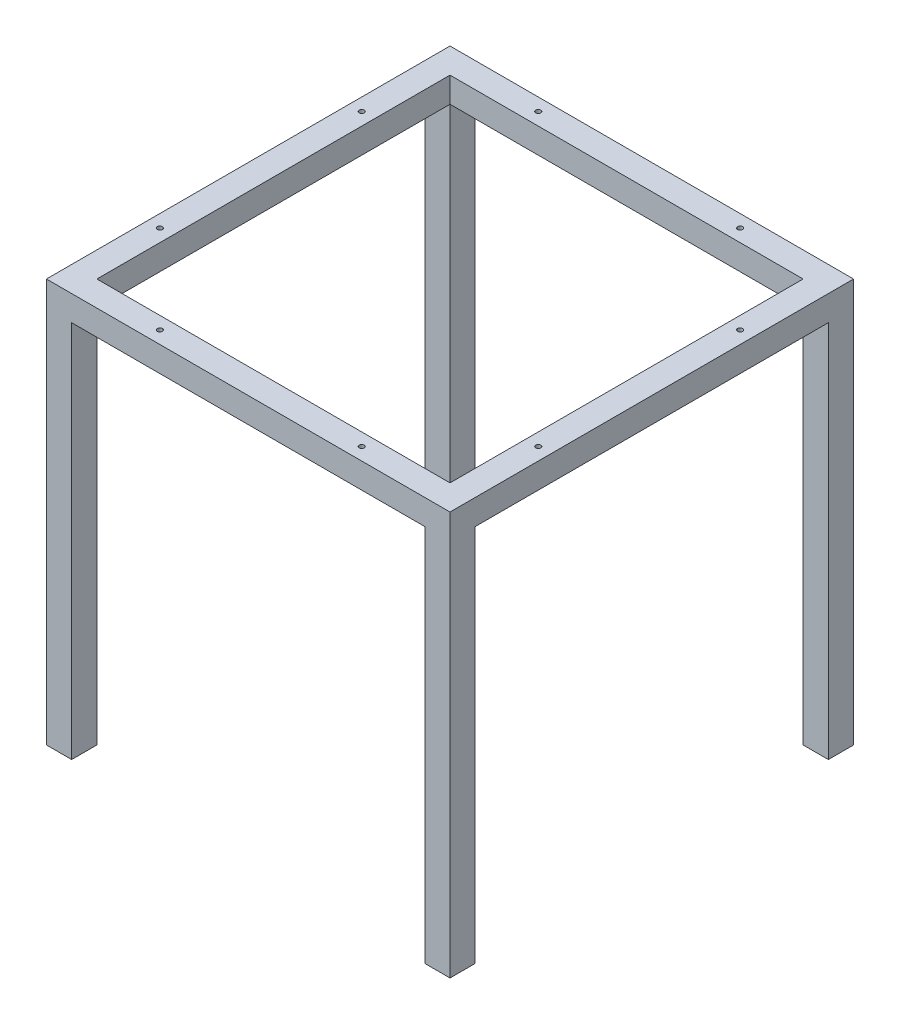
ISO-10303-21;
HEADER;
FILE_DESCRIPTION(('STEP AP214'),'2;1');
FILE_NAME('part.step','',(''),(''),'','','');
FILE_SCHEMA(('AUTOMOTIVE_DESIGN { 1 0 10303 214 1 1 1 1 }'));
ENDSEC;
DATA;
#1=APPLICATION_CONTEXT('core data for automotive mechanical design processes');
#2=APPLICATION_PROTOCOL_DEFINITION('international standard','automotive_design',2000,#1);
#3=PRODUCT_CONTEXT('',#1,'mechanical');
#4=PRODUCT('Part','Part','',(#3));
#5=PRODUCT_RELATED_PRODUCT_CATEGORY('part','',(#4));
#6=PRODUCT_DEFINITION_FORMATION('','',#4);
#7=PRODUCT_DEFINITION_CONTEXT('part definition',#1,'design');
#8=PRODUCT_DEFINITION('design','',#6,#7);
#9=PRODUCT_DEFINITION_SHAPE('','',#8);
#10=(LENGTH_UNIT() NAMED_UNIT(*) SI_UNIT(.MILLI.,.METRE.));
#11=(NAMED_UNIT(*) PLANE_ANGLE_UNIT() SI_UNIT($,.RADIAN.));
#12=(NAMED_UNIT(*) SI_UNIT($,.STERADIAN.) SOLID_ANGLE_UNIT());
#13=UNCERTAINTY_MEASURE_WITH_UNIT(LENGTH_MEASURE(1.E-05),#10,'distance_accuracy_value','');
#14=(GEOMETRIC_REPRESENTATION_CONTEXT(3) GLOBAL_UNCERTAINTY_ASSIGNED_CONTEXT((#13)) GLOBAL_UNIT_ASSIGNED_CONTEXT((#10,
#11,#12)) REPRESENTATION_CONTEXT('',''));
#15=CARTESIAN_POINT('',(0.,0.,0.));
#16=DIRECTION('',(0.,0.,1.));
#17=DIRECTION('',(1.,0.,0.));
#18=AXIS2_PLACEMENT_3D('',#15,#16,#17);
#19=CARTESIAN_POINT('',(0.,0.,0.));
#20=DIRECTION('',(0.,-1.,0.));
#21=DIRECTION('',(0.,0.,-1.));
#22=AXIS2_PLACEMENT_3D('',#19,#20,#21);
#23=PLANE('',#22);
#24=CARTESIAN_POINT('',(200.,0.,-375.));
#25=DIRECTION('',(0.,-1.,0.));
#26=DIRECTION('',(0.,0.,-1.));
#27=AXIS2_PLACEMENT_3D('',#24,#25,#26);
#28=CIRCLE('',#27,4.99999999999999);
#29=CARTESIAN_POINT('',(200.,0.,-380.));
#30=VERTEX_POINT('',#29);
#31=EDGE_CURVE('E395',#30,#30,#28,.T.);
#32=ORIENTED_EDGE('',*,*,#31,.F.);
#33=EDGE_LOOP('',(#32));
#34=FACE_BOUND('',#33,.T.);
#35=CARTESIAN_POINT('',(-200.,0.,-375.));
#36=DIRECTION('',(0.,-1.,0.));
#37=DIRECTION('',(0.,0.,-1.));
#38=AXIS2_PLACEMENT_3D('',#35,#36,#37);
#39=CIRCLE('',#38,4.99999999999999);
#40=CARTESIAN_POINT('',(-200.,0.,-380.));
#41=VERTEX_POINT('',#40);
#42=EDGE_CURVE('E390',#41,#41,#39,.T.);
#43=ORIENTED_EDGE('',*,*,#42,.F.);
#44=EDGE_LOOP('',(#43));
#45=FACE_BOUND('',#44,.T.);
#46=DIRECTION('',(-1.,0.,0.));
#47=VECTOR('',#46,1.);
#48=CARTESIAN_POINT('',(-350.,0.,-350.));
#49=LINE('',#48,#47);
#50=CARTESIAN_POINT('',(350.,0.,-350.));
#51=VERTEX_POINT('',#50);
#52=CARTESIAN_POINT('',(-350.,0.,-350.));
#53=VERTEX_POINT('',#52);
#54=EDGE_CURVE('E313',#51,#53,#49,.T.);
#55=ORIENTED_EDGE('',*,*,#54,.T.);
#56=DIRECTION('',(0.,0.,-1.));
#57=VECTOR('',#56,1.);
#58=CARTESIAN_POINT('',(-350.,0.,0.));
#59=LINE('',#58,#57);
#60=CARTESIAN_POINT('',(-350.,0.,-400.));
#61=VERTEX_POINT('',#60);
#62=EDGE_CURVE('E202',#53,#61,#59,.T.);
#63=ORIENTED_EDGE('',*,*,#62,.T.);
#64=DIRECTION('',(-1.,0.,0.));
#65=VECTOR('',#64,1.);
#66=CARTESIAN_POINT('',(-400.,0.,-400.));
#67=LINE('',#66,#65);
#68=CARTESIAN_POINT('',(350.,0.,-400.));
#69=VERTEX_POINT('',#68);
#70=EDGE_CURVE('E371',#69,#61,#67,.T.);
#71=ORIENTED_EDGE('',*,*,#70,.F.);
#72=DIRECTION('',(0.,0.,1.));
#73=VECTOR('',#72,1.);
#74=CARTESIAN_POINT('',(350.,0.,0.));
#75=LINE('',#74,#73);
#76=EDGE_CURVE('E237',#69,#51,#75,.T.);
#77=ORIENTED_EDGE('',*,*,#76,.T.);
#78=EDGE_LOOP('',(#55,#63,#71,#77));
#79=FACE_BOUND('',#78,.T.);
#80=ADVANCED_FACE('F45',(#34,#45,#79),#23,.T.);
#81=CARTESIAN_POINT('',(-375.,0.,-200.));
#82=DIRECTION('',(0.,-1.,0.));
#83=DIRECTION('',(0.,0.,-1.));
#84=AXIS2_PLACEMENT_3D('',#81,#82,#83);
#85=CIRCLE('',#84,4.99999999999999);
#86=CARTESIAN_POINT('',(-375.,0.,-205.));
#87=VERTEX_POINT('',#86);
#88=EDGE_CURVE('E432',#87,#87,#85,.T.);
#89=ORIENTED_EDGE('',*,*,#88,.F.);
#90=EDGE_LOOP('',(#89));
#91=FACE_BOUND('',#90,.T.);
#92=CARTESIAN_POINT('',(-375.,0.,200.));
#93=DIRECTION('',(0.,-1.,0.));
#94=DIRECTION('',(0.,0.,-1.));
#95=AXIS2_PLACEMENT_3D('',#92,#93,#94);
#96=CIRCLE('',#95,4.99999999999999);
#97=CARTESIAN_POINT('',(-375.,0.,195.));
#98=VERTEX_POINT('',#97);
#99=EDGE_CURVE('E418',#98,#98,#96,.T.);
#100=ORIENTED_EDGE('',*,*,#99,.F.);
#101=EDGE_LOOP('',(#100));
#102=FACE_BOUND('',#101,.T.);
#103=DIRECTION('',(0.,0.,1.));
#104=VECTOR('',#103,1.);
#105=CARTESIAN_POINT('',(-400.,0.,400.));
#106=LINE('',#105,#104);
#107=CARTESIAN_POINT('',(-400.,0.,-350.));
#108=VERTEX_POINT('',#107);
#109=CARTESIAN_POINT('',(-400.,0.,350.));
#110=VERTEX_POINT('',#109);
#111=EDGE_CURVE('E374',#108,#110,#106,.T.);
#112=ORIENTED_EDGE('',*,*,#111,.F.);
#113=DIRECTION('',(1.,0.,0.));
#114=VECTOR('',#113,1.);
#115=CARTESIAN_POINT('',(0.,0.,-350.));
#116=LINE('',#115,#114);
#117=EDGE_CURVE('E191',#108,#53,#116,.T.);
#118=ORIENTED_EDGE('',*,*,#117,.T.);
#119=DIRECTION('',(0.,0.,1.));
#120=VECTOR('',#119,1.);
#121=CARTESIAN_POINT('',(-350.,0.,-350.));
#122=LINE('',#121,#120);
#123=CARTESIAN_POINT('',(-350.,0.,350.));
#124=VERTEX_POINT('',#123);
#125=EDGE_CURVE('E308',#53,#124,#122,.T.);
#126=ORIENTED_EDGE('',*,*,#125,.T.);
#127=DIRECTION('',(-1.,0.,0.));
#128=VECTOR('',#127,1.);
#129=CARTESIAN_POINT('',(3.88578058618804E-13,0.,350.));
#130=LINE('',#129,#128);
#131=EDGE_CURVE('E304',#124,#110,#130,.T.);
#132=ORIENTED_EDGE('',*,*,#131,.T.);
#133=EDGE_LOOP('',(#112,#118,#126,#132));
#134=FACE_BOUND('',#133,.T.);
#135=ADVANCED_FACE('F460',(#91,#102,#134),#23,.T.);
#136=CARTESIAN_POINT('',(375.,0.,200.));
#137=DIRECTION('',(0.,-1.,0.));
#138=DIRECTION('',(0.,0.,-1.));
#139=AXIS2_PLACEMENT_3D('',#136,#137,#138);
#140=CIRCLE('',#139,4.99999999999999);
#141=CARTESIAN_POINT('',(375.,0.,195.));
#142=VERTEX_POINT('',#141);
#143=EDGE_CURVE('E405',#142,#142,#140,.T.);
#144=ORIENTED_EDGE('',*,*,#143,.F.);
#145=EDGE_LOOP('',(#144));
#146=FACE_BOUND('',#145,.T.);
#147=CARTESIAN_POINT('',(375.,0.,-200.));
#148=DIRECTION('',(0.,-1.,0.));
#149=DIRECTION('',(0.,0.,-1.));
#150=AXIS2_PLACEMENT_3D('',#147,#148,#149);
#151=CIRCLE('',#150,4.99999999999999);
#152=CARTESIAN_POINT('',(375.,0.,-205.));
#153=VERTEX_POINT('',#152);
#154=EDGE_CURVE('E400',#153,#153,#151,.T.);
#155=ORIENTED_EDGE('',*,*,#154,.F.);
#156=EDGE_LOOP('',(#155));
#157=FACE_BOUND('',#156,.T.);
#158=DIRECTION('',(0.,0.,-1.));
#159=VECTOR('',#158,1.);
#160=CARTESIAN_POINT('',(350.,0.,-350.));
#161=LINE('',#160,#159);
#162=CARTESIAN_POINT('',(350.,0.,350.));
#163=VERTEX_POINT('',#162);
#164=EDGE_CURVE('E331',#163,#51,#161,.T.);
#165=ORIENTED_EDGE('',*,*,#164,.T.);
#166=DIRECTION('',(1.,0.,0.));
#167=VECTOR('',#166,1.);
#168=CARTESIAN_POINT('',(0.,0.,-350.));
#169=LINE('',#168,#167);
#170=CARTESIAN_POINT('',(400.,0.,-350.));
#171=VERTEX_POINT('',#170);
#172=EDGE_CURVE('E241',#51,#171,#169,.T.);
#173=ORIENTED_EDGE('',*,*,#172,.T.);
#174=DIRECTION('',(0.,0.,-1.));
#175=VECTOR('',#174,1.);
#176=CARTESIAN_POINT('',(400.,0.,400.));
#177=LINE('',#176,#175);
#178=CARTESIAN_POINT('',(400.,0.,350.));
#179=VERTEX_POINT('',#178);
#180=EDGE_CURVE('E353',#179,#171,#177,.T.);
#181=ORIENTED_EDGE('',*,*,#180,.F.);
#182=DIRECTION('',(-1.,0.,0.));
#183=VECTOR('',#182,1.);
#184=CARTESIAN_POINT('',(0.,0.,350.));
#185=LINE('',#184,#183);
#186=EDGE_CURVE('E268',#179,#163,#185,.T.);
#187=ORIENTED_EDGE('',*,*,#186,.T.);
#188=EDGE_LOOP('',(#165,#173,#181,#187));
#189=FACE_BOUND('',#188,.T.);
#190=ADVANCED_FACE('F468',(#146,#157,#189),#23,.T.);
#191=CARTESIAN_POINT('',(-200.,0.,375.));
#192=DIRECTION('',(0.,-1.,0.));
#193=DIRECTION('',(0.,0.,-1.));
#194=AXIS2_PLACEMENT_3D('',#191,#192,#193);
#195=CIRCLE('',#194,4.99999999999999);
#196=CARTESIAN_POINT('',(-200.,0.,370.));
#197=VERTEX_POINT('',#196);
#198=EDGE_CURVE('E414',#197,#197,#195,.T.);
#199=ORIENTED_EDGE('',*,*,#198,.F.);
#200=EDGE_LOOP('',(#199));
#201=FACE_BOUND('',#200,.T.);
#202=CARTESIAN_POINT('',(200.,0.,375.));
#203=DIRECTION('',(0.,-1.,0.));
#204=DIRECTION('',(0.,0.,-1.));
#205=AXIS2_PLACEMENT_3D('',#202,#203,#204);
#206=CIRCLE('',#205,4.99999999999999);
#207=CARTESIAN_POINT('',(200.,0.,370.));
#208=VERTEX_POINT('',#207);
#209=EDGE_CURVE('E410',#208,#208,#206,.T.);
#210=ORIENTED_EDGE('',*,*,#209,.F.);
#211=EDGE_LOOP('',(#210));
#212=FACE_BOUND('',#211,.T.);
#213=DIRECTION('',(1.,0.,0.));
#214=VECTOR('',#213,1.);
#215=CARTESIAN_POINT('',(-350.,0.,350.));
#216=LINE('',#215,#214);
#217=EDGE_CURVE('E327',#124,#163,#216,.T.);
#218=ORIENTED_EDGE('',*,*,#217,.T.);
#219=DIRECTION('',(0.,0.,1.));
#220=VECTOR('',#219,1.);
#221=CARTESIAN_POINT('',(350.,0.,0.));
#222=LINE('',#221,#220);
#223=CARTESIAN_POINT('',(350.,0.,400.));
#224=VERTEX_POINT('',#223);
#225=EDGE_CURVE('E272',#163,#224,#222,.T.);
#226=ORIENTED_EDGE('',*,*,#225,.T.);
#227=DIRECTION('',(1.,0.,0.));
#228=VECTOR('',#227,1.);
#229=CARTESIAN_POINT('',(-400.,0.,400.));
#230=LINE('',#229,#228);
#231=CARTESIAN_POINT('',(-350.,0.,400.));
#232=VERTEX_POINT('',#231);
#233=EDGE_CURVE('E358',#232,#224,#230,.T.);
#234=ORIENTED_EDGE('',*,*,#233,.F.);
#235=DIRECTION('',(0.,0.,-1.));
#236=VECTOR('',#235,1.);
#237=CARTESIAN_POINT('',(-350.,0.,0.));
#238=LINE('',#237,#236);
#239=EDGE_CURVE('E300',#232,#124,#238,.T.);
#240=ORIENTED_EDGE('',*,*,#239,.T.);
#241=EDGE_LOOP('',(#218,#226,#234,#240));
#242=FACE_BOUND('',#241,.T.);
#243=ADVANCED_FACE('F463',(#201,#212,#242),#23,.T.);
#244=CARTESIAN_POINT('',(0.,50.,0.));
#245=DIRECTION('',(0.,-1.,0.));
#246=DIRECTION('',(0.,0.,-1.));
#247=AXIS2_PLACEMENT_3D('',#244,#245,#246);
#248=PLANE('',#247);
#249=CARTESIAN_POINT('',(-375.,50.,-200.));
#250=DIRECTION('',(0.,-1.,0.));
#251=DIRECTION('',(0.,0.,-1.));
#252=AXIS2_PLACEMENT_3D('',#249,#250,#251);
#253=CIRCLE('',#252,4.99999999999999);
#254=CARTESIAN_POINT('',(-375.,50.,-205.));
#255=VERTEX_POINT('',#254);
#256=EDGE_CURVE('E49',#255,#255,#253,.T.);
#257=ORIENTED_EDGE('',*,*,#256,.T.);
#258=EDGE_LOOP('',(#257));
#259=FACE_BOUND('',#258,.T.);
#260=CARTESIAN_POINT('',(-375.,50.,200.));
#261=DIRECTION('',(0.,-1.,0.));
#262=DIRECTION('',(0.,0.,-1.));
#263=AXIS2_PLACEMENT_3D('',#260,#261,#262);
#264=CIRCLE('',#263,4.99999999999999);
#265=CARTESIAN_POINT('',(-375.,50.,195.));
#266=VERTEX_POINT('',#265);
#267=EDGE_CURVE('E415',#266,#266,#264,.T.);
#268=ORIENTED_EDGE('',*,*,#267,.T.);
#269=EDGE_LOOP('',(#268));
#270=FACE_BOUND('',#269,.T.);
#271=CARTESIAN_POINT('',(-200.,50.,375.));
#272=DIRECTION('',(0.,-1.,0.));
#273=DIRECTION('',(0.,0.,-1.));
#274=AXIS2_PLACEMENT_3D('',#271,#272,#273);
#275=CIRCLE('',#274,4.99999999999999);
#276=CARTESIAN_POINT('',(-200.,50.,370.));
#277=VERTEX_POINT('',#276);
#278=EDGE_CURVE('E411',#277,#277,#275,.T.);
#279=ORIENTED_EDGE('',*,*,#278,.T.);
#280=EDGE_LOOP('',(#279));
#281=FACE_BOUND('',#280,.T.);
#282=CARTESIAN_POINT('',(200.,50.,375.));
#283=DIRECTION('',(0.,-1.,0.));
#284=DIRECTION('',(0.,0.,-1.));
#285=AXIS2_PLACEMENT_3D('',#282,#283,#284);
#286=CIRCLE('',#285,4.99999999999999);
#287=CARTESIAN_POINT('',(200.,50.,370.));
#288=VERTEX_POINT('',#287);
#289=EDGE_CURVE('E406',#288,#288,#286,.T.);
#290=ORIENTED_EDGE('',*,*,#289,.T.);
#291=EDGE_LOOP('',(#290));
#292=FACE_BOUND('',#291,.T.);
#293=CARTESIAN_POINT('',(375.,50.,200.));
#294=DIRECTION('',(0.,-1.,0.));
#295=DIRECTION('',(0.,0.,-1.));
#296=AXIS2_PLACEMENT_3D('',#293,#294,#295);
#297=CIRCLE('',#296,4.99999999999999);
#298=CARTESIAN_POINT('',(375.,50.,195.));
#299=VERTEX_POINT('',#298);
#300=EDGE_CURVE('E401',#299,#299,#297,.T.);
#301=ORIENTED_EDGE('',*,*,#300,.T.);
#302=EDGE_LOOP('',(#301));
#303=FACE_BOUND('',#302,.T.);
#304=CARTESIAN_POINT('',(375.,50.,-200.));
#305=DIRECTION('',(0.,-1.,0.));
#306=DIRECTION('',(0.,0.,-1.));
#307=AXIS2_PLACEMENT_3D('',#304,#305,#306);
#308=CIRCLE('',#307,4.99999999999999);
#309=CARTESIAN_POINT('',(375.,50.,-205.));
#310=VERTEX_POINT('',#309);
#311=EDGE_CURVE('E396',#310,#310,#308,.T.);
#312=ORIENTED_EDGE('',*,*,#311,.T.);
#313=EDGE_LOOP('',(#312));
#314=FACE_BOUND('',#313,.T.);
#315=CARTESIAN_POINT('',(200.,50.,-375.));
#316=DIRECTION('',(0.,-1.,0.));
#317=DIRECTION('',(0.,0.,-1.));
#318=AXIS2_PLACEMENT_3D('',#315,#316,#317);
#319=CIRCLE('',#318,4.99999999999999);
#320=CARTESIAN_POINT('',(200.,50.,-380.));
#321=VERTEX_POINT('',#320);
#322=EDGE_CURVE('E391',#321,#321,#319,.T.);
#323=ORIENTED_EDGE('',*,*,#322,.T.);
#324=EDGE_LOOP('',(#323));
#325=FACE_BOUND('',#324,.T.);
#326=CARTESIAN_POINT('',(-200.,50.,-375.));
#327=DIRECTION('',(0.,-1.,0.));
#328=DIRECTION('',(0.,0.,-1.));
#329=AXIS2_PLACEMENT_3D('',#326,#327,#328);
#330=CIRCLE('',#329,4.99999999999999);
#331=CARTESIAN_POINT('',(-200.,50.,-380.));
#332=VERTEX_POINT('',#331);
#333=EDGE_CURVE('E386',#332,#332,#330,.T.);
#334=ORIENTED_EDGE('',*,*,#333,.T.);
#335=EDGE_LOOP('',(#334));
#336=FACE_BOUND('',#335,.T.);
#337=DIRECTION('',(-1.,0.,0.));
#338=VECTOR('',#337,1.);
#339=CARTESIAN_POINT('',(-400.,50.,-400.));
#340=LINE('',#339,#338);
#341=CARTESIAN_POINT('',(400.,50.,-400.));
#342=VERTEX_POINT('',#341);
#343=CARTESIAN_POINT('',(-400.,50.,-400.));
#344=VERTEX_POINT('',#343);
#345=EDGE_CURVE('E357',#342,#344,#340,.T.);
#346=ORIENTED_EDGE('',*,*,#345,.T.);
#347=DIRECTION('',(0.,0.,1.));
#348=VECTOR('',#347,1.);
#349=CARTESIAN_POINT('',(-400.,50.,400.));
#350=LINE('',#349,#348);
#351=CARTESIAN_POINT('',(-400.,50.,400.));
#352=VERTEX_POINT('',#351);
#353=EDGE_CURVE('E361',#344,#352,#350,.T.);
#354=ORIENTED_EDGE('',*,*,#353,.T.);
#355=DIRECTION('',(1.,0.,0.));
#356=VECTOR('',#355,1.);
#357=CARTESIAN_POINT('',(-400.,50.,400.));
#358=LINE('',#357,#356);
#359=CARTESIAN_POINT('',(400.,50.,400.));
#360=VERTEX_POINT('',#359);
#361=EDGE_CURVE('E364',#352,#360,#358,.T.);
#362=ORIENTED_EDGE('',*,*,#361,.T.);
#363=DIRECTION('',(0.,0.,-1.));
#364=VECTOR('',#363,1.);
#365=CARTESIAN_POINT('',(400.,50.,400.));
#366=LINE('',#365,#364);
#367=EDGE_CURVE('E354',#360,#342,#366,.T.);
#368=ORIENTED_EDGE('',*,*,#367,.T.);
#369=EDGE_LOOP('',(#346,#354,#362,#368));
#370=FACE_BOUND('',#369,.T.);
#371=DIRECTION('',(0.,0.,1.));
#372=VECTOR('',#371,1.);
#373=CARTESIAN_POINT('',(-350.,50.,-350.));
#374=LINE('',#373,#372);
#375=CARTESIAN_POINT('',(-350.,50.,-350.));
#376=VERTEX_POINT('',#375);
#377=CARTESIAN_POINT('',(-350.,50.,350.));
#378=VERTEX_POINT('',#377);
#379=EDGE_CURVE('E309',#376,#378,#374,.T.);
#380=ORIENTED_EDGE('',*,*,#379,.F.);
#381=DIRECTION('',(-1.,0.,0.));
#382=VECTOR('',#381,1.);
#383=CARTESIAN_POINT('',(-350.,50.,-350.));
#384=LINE('',#383,#382);
#385=CARTESIAN_POINT('',(350.,50.,-350.));
#386=VERTEX_POINT('',#385);
#387=EDGE_CURVE('E320',#386,#376,#384,.T.);
#388=ORIENTED_EDGE('',*,*,#387,.F.);
#389=DIRECTION('',(0.,0.,-1.));
#390=VECTOR('',#389,1.);
#391=CARTESIAN_POINT('',(350.,50.,-350.));
#392=LINE('',#391,#390);
#393=CARTESIAN_POINT('',(350.,50.,350.));
#394=VERTEX_POINT('',#393);
#395=EDGE_CURVE('E316',#394,#386,#392,.T.);
#396=ORIENTED_EDGE('',*,*,#395,.F.);
#397=DIRECTION('',(1.,0.,0.));
#398=VECTOR('',#397,1.);
#399=CARTESIAN_POINT('',(-350.,50.,350.));
#400=LINE('',#399,#398);
#401=EDGE_CURVE('E312',#378,#394,#400,.T.);
#402=ORIENTED_EDGE('',*,*,#401,.F.);
#403=EDGE_LOOP('',(#380,#388,#396,#402));
#404=FACE_BOUND('',#403,.T.);
#405=ADVANCED_FACE('F445',(#259,#270,#281,#292,#303,#314,#325,#336,#370,#404),#248,.F.);
#406=CARTESIAN_POINT('',(400.,50.,400.));
#407=DIRECTION('',(-1.,0.,0.));
#408=DIRECTION('',(0.,0.,1.));
#409=AXIS2_PLACEMENT_3D('',#406,#407,#408);
#410=PLANE('',#409);
#411=DIRECTION('',(0.,-1.,0.));
#412=VECTOR('',#411,1.);
#413=CARTESIAN_POINT('',(400.,50.,-400.));
#414=LINE('',#413,#412);
#415=CARTESIAN_POINT('',(400.,-750.,-400.));
#416=VERTEX_POINT('',#415);
#417=EDGE_CURVE('E11',#342,#416,#414,.T.);
#418=ORIENTED_EDGE('',*,*,#417,.F.);
#419=ORIENTED_EDGE('',*,*,#367,.F.);
#420=DIRECTION('',(0.,-1.,0.));
#421=VECTOR('',#420,1.);
#422=CARTESIAN_POINT('',(400.,50.,400.));
#423=LINE('',#422,#421);
#424=CARTESIAN_POINT('',(400.,-750.,400.));
#425=VERTEX_POINT('',#424);
#426=EDGE_CURVE('E367',#360,#425,#423,.T.);
#427=ORIENTED_EDGE('',*,*,#426,.T.);
#428=DIRECTION('',(0.,0.,1.));
#429=VECTOR('',#428,1.);
#430=CARTESIAN_POINT('',(400.,-750.,400.));
#431=LINE('',#430,#429);
#432=CARTESIAN_POINT('',(400.,-750.,350.));
#433=VERTEX_POINT('',#432);
#434=EDGE_CURVE('E264',#433,#425,#431,.T.);
#435=ORIENTED_EDGE('',*,*,#434,.F.);
#436=DIRECTION('',(0.,1.,0.));
#437=VECTOR('',#436,1.);
#438=CARTESIAN_POINT('',(400.,-750.,350.));
#439=LINE('',#438,#437);
#440=EDGE_CURVE('E251',#433,#179,#439,.T.);
#441=ORIENTED_EDGE('',*,*,#440,.T.);
#442=ORIENTED_EDGE('',*,*,#180,.T.);
#443=DIRECTION('',(0.,1.,0.));
#444=VECTOR('',#443,1.);
#445=CARTESIAN_POINT('',(400.,-750.,-350.));
#446=LINE('',#445,#444);
#447=CARTESIAN_POINT('',(400.,-750.,-350.));
#448=VERTEX_POINT('',#447);
#449=EDGE_CURVE('E214',#448,#171,#446,.T.);
#450=ORIENTED_EDGE('',*,*,#449,.F.);
#451=DIRECTION('',(0.,0.,1.));
#452=VECTOR('',#451,1.);
#453=CARTESIAN_POINT('',(400.,-750.,-400.));
#454=LINE('',#453,#452);
#455=EDGE_CURVE('E233',#416,#448,#454,.T.);
#456=ORIENTED_EDGE('',*,*,#455,.F.);
#457=EDGE_LOOP('',(#418,#419,#427,#435,#441,#442,#450,#456));
#458=FACE_BOUND('',#457,.T.);
#459=ADVANCED_FACE('F47',(#458),#410,.F.);
#460=CARTESIAN_POINT('',(-400.,50.,-400.));
#461=DIRECTION('',(0.,0.,1.));
#462=DIRECTION('',(1.,0.,0.));
#463=AXIS2_PLACEMENT_3D('',#460,#461,#462);
#464=PLANE('',#463);
#465=DIRECTION('',(0.,-1.,0.));
#466=VECTOR('',#465,1.);
#467=CARTESIAN_POINT('',(-400.,50.,-400.));
#468=LINE('',#467,#466);
#469=CARTESIAN_POINT('',(-400.,-750.,-400.));
#470=VERTEX_POINT('',#469);
#471=EDGE_CURVE('E55',#344,#470,#468,.T.);
#472=ORIENTED_EDGE('',*,*,#471,.F.);
#473=ORIENTED_EDGE('',*,*,#345,.F.);
#474=ORIENTED_EDGE('',*,*,#417,.T.);
#475=DIRECTION('',(1.,0.,0.));
#476=VECTOR('',#475,1.);
#477=CARTESIAN_POINT('',(400.,-750.,-400.));
#478=LINE('',#477,#476);
#479=CARTESIAN_POINT('',(350.,-750.,-400.));
#480=VERTEX_POINT('',#479);
#481=EDGE_CURVE('E223',#480,#416,#478,.T.);
#482=ORIENTED_EDGE('',*,*,#481,.F.);
#483=DIRECTION('',(0.,1.,0.));
#484=VECTOR('',#483,1.);
#485=CARTESIAN_POINT('',(350.,-750.,-400.));
#486=LINE('',#485,#484);
#487=EDGE_CURVE('E63',#480,#69,#486,.T.);
#488=ORIENTED_EDGE('',*,*,#487,.T.);
#489=ORIENTED_EDGE('',*,*,#70,.T.);
#490=DIRECTION('',(0.,1.,0.));
#491=VECTOR('',#490,1.);
#492=CARTESIAN_POINT('',(-350.,-750.,-400.));
#493=LINE('',#492,#491);
#494=CARTESIAN_POINT('',(-350.,-750.,-400.));
#495=VERTEX_POINT('',#494);
#496=EDGE_CURVE('E436',#495,#61,#493,.T.);
#497=ORIENTED_EDGE('',*,*,#496,.F.);
#498=DIRECTION('',(1.,0.,0.));
#499=VECTOR('',#498,1.);
#500=CARTESIAN_POINT('',(-400.,-750.,-400.));
#501=LINE('',#500,#499);
#502=EDGE_CURVE('E203',#470,#495,#501,.T.);
#503=ORIENTED_EDGE('',*,*,#502,.F.);
#504=EDGE_LOOP('',(#472,#473,#474,#482,#488,#489,#497,#503));
#505=FACE_BOUND('',#504,.T.);
#506=ADVANCED_FACE('F518',(#505),#464,.F.);
#507=CARTESIAN_POINT('',(-400.,50.,400.));
#508=DIRECTION('',(1.,0.,0.));
#509=DIRECTION('',(0.,0.,-1.));
#510=AXIS2_PLACEMENT_3D('',#507,#508,#509);
#511=PLANE('',#510);
#512=ORIENTED_EDGE('',*,*,#471,.T.);
#513=DIRECTION('',(0.,0.,-1.));
#514=VECTOR('',#513,1.);
#515=CARTESIAN_POINT('',(-400.,-750.,-400.));
#516=LINE('',#515,#514);
#517=CARTESIAN_POINT('',(-400.,-750.,-350.));
#518=VERTEX_POINT('',#517);
#519=EDGE_CURVE('E180',#518,#470,#516,.T.);
#520=ORIENTED_EDGE('',*,*,#519,.F.);
#521=DIRECTION('',(0.,1.,0.));
#522=VECTOR('',#521,1.);
#523=CARTESIAN_POINT('',(-400.,-750.,-350.));
#524=LINE('',#523,#522);
#525=EDGE_CURVE('E186',#518,#108,#524,.T.);
#526=ORIENTED_EDGE('',*,*,#525,.T.);
#527=ORIENTED_EDGE('',*,*,#111,.T.);
#528=DIRECTION('',(0.,1.,0.));
#529=VECTOR('',#528,1.);
#530=CARTESIAN_POINT('',(-400.,-750.,350.));
#531=LINE('',#530,#529);
#532=CARTESIAN_POINT('',(-400.,-750.,350.));
#533=VERTEX_POINT('',#532);
#534=EDGE_CURVE('E296',#533,#110,#531,.T.);
#535=ORIENTED_EDGE('',*,*,#534,.F.);
#536=DIRECTION('',(0.,0.,-1.));
#537=VECTOR('',#536,1.);
#538=CARTESIAN_POINT('',(-400.,-750.,400.));
#539=LINE('',#538,#537);
#540=CARTESIAN_POINT('',(-400.,-750.,400.));
#541=VERTEX_POINT('',#540);
#542=EDGE_CURVE('E276',#541,#533,#539,.T.);
#543=ORIENTED_EDGE('',*,*,#542,.F.);
#544=DIRECTION('',(0.,-1.,0.));
#545=VECTOR('',#544,1.);
#546=CARTESIAN_POINT('',(-400.,50.,400.));
#547=LINE('',#546,#545);
#548=EDGE_CURVE('E381',#352,#541,#547,.T.);
#549=ORIENTED_EDGE('',*,*,#548,.F.);
#550=ORIENTED_EDGE('',*,*,#353,.F.);
#551=EDGE_LOOP('',(#512,#520,#526,#527,#535,#543,#549,#550));
#552=FACE_BOUND('',#551,.T.);
#553=ADVANCED_FACE('F197',(#552),#511,.F.);
#554=CARTESIAN_POINT('',(-400.,50.,400.));
#555=DIRECTION('',(0.,0.,-1.));
#556=DIRECTION('',(-1.,0.,0.));
#557=AXIS2_PLACEMENT_3D('',#554,#555,#556);
#558=PLANE('',#557);
#559=ORIENTED_EDGE('',*,*,#426,.F.);
#560=ORIENTED_EDGE('',*,*,#361,.F.);
#561=ORIENTED_EDGE('',*,*,#548,.T.);
#562=DIRECTION('',(-1.,0.,0.));
#563=VECTOR('',#562,1.);
#564=CARTESIAN_POINT('',(-400.,-750.,400.));
#565=LINE('',#564,#563);
#566=CARTESIAN_POINT('',(-350.,-750.,400.));
#567=VERTEX_POINT('',#566);
#568=EDGE_CURVE('E286',#567,#541,#565,.T.);
#569=ORIENTED_EDGE('',*,*,#568,.F.);
#570=DIRECTION('',(0.,1.,0.));
#571=VECTOR('',#570,1.);
#572=CARTESIAN_POINT('',(-350.,-750.,400.));
#573=LINE('',#572,#571);
#574=EDGE_CURVE('E71',#567,#232,#573,.T.);
#575=ORIENTED_EDGE('',*,*,#574,.T.);
#576=ORIENTED_EDGE('',*,*,#233,.T.);
#577=DIRECTION('',(0.,1.,0.));
#578=VECTOR('',#577,1.);
#579=CARTESIAN_POINT('',(350.,-750.,400.));
#580=LINE('',#579,#578);
#581=CARTESIAN_POINT('',(350.,-750.,400.));
#582=VERTEX_POINT('',#581);
#583=EDGE_CURVE('E245',#582,#224,#580,.T.);
#584=ORIENTED_EDGE('',*,*,#583,.F.);
#585=DIRECTION('',(-1.,0.,0.));
#586=VECTOR('',#585,1.);
#587=CARTESIAN_POINT('',(400.,-750.,400.));
#588=LINE('',#587,#586);
#589=EDGE_CURVE('E261',#425,#582,#588,.T.);
#590=ORIENTED_EDGE('',*,*,#589,.F.);
#591=EDGE_LOOP('',(#559,#560,#561,#569,#575,#576,#584,#590));
#592=FACE_BOUND('',#591,.T.);
#593=ADVANCED_FACE('F511',(#592),#558,.F.);
#594=CARTESIAN_POINT('',(-350.,50.,-350.));
#595=DIRECTION('',(1.,0.,0.));
#596=DIRECTION('',(0.,0.,-1.));
#597=AXIS2_PLACEMENT_3D('',#594,#595,#596);
#598=PLANE('',#597);
#599=ORIENTED_EDGE('',*,*,#125,.F.);
#600=DIRECTION('',(0.,-1.,0.));
#601=VECTOR('',#600,1.);
#602=CARTESIAN_POINT('',(-350.,50.,-350.));
#603=LINE('',#602,#601);
#604=EDGE_CURVE('E323',#376,#53,#603,.T.);
#605=ORIENTED_EDGE('',*,*,#604,.F.);
#606=ORIENTED_EDGE('',*,*,#379,.T.);
#607=DIRECTION('',(0.,-1.,0.));
#608=VECTOR('',#607,1.);
#609=CARTESIAN_POINT('',(-350.,50.,350.));
#610=LINE('',#609,#608);
#611=EDGE_CURVE('E349',#378,#124,#610,.T.);
#612=ORIENTED_EDGE('',*,*,#611,.T.);
#613=EDGE_LOOP('',(#599,#605,#606,#612));
#614=FACE_BOUND('',#613,.T.);
#615=ADVANCED_FACE('F496',(#614),#598,.T.);
#616=CARTESIAN_POINT('',(-350.,50.,350.));
#617=DIRECTION('',(0.,0.,-1.));
#618=DIRECTION('',(-1.,0.,0.));
#619=AXIS2_PLACEMENT_3D('',#616,#617,#618);
#620=PLANE('',#619);
#621=ORIENTED_EDGE('',*,*,#217,.F.);
#622=ORIENTED_EDGE('',*,*,#611,.F.);
#623=ORIENTED_EDGE('',*,*,#401,.T.);
#624=DIRECTION('',(0.,-1.,0.));
#625=VECTOR('',#624,1.);
#626=CARTESIAN_POINT('',(350.,50.,350.));
#627=LINE('',#626,#625);
#628=EDGE_CURVE('E345',#394,#163,#627,.T.);
#629=ORIENTED_EDGE('',*,*,#628,.T.);
#630=EDGE_LOOP('',(#621,#622,#623,#629));
#631=FACE_BOUND('',#630,.T.);
#632=ADVANCED_FACE('F490',(#631),#620,.T.);
#633=CARTESIAN_POINT('',(350.,50.,-350.));
#634=DIRECTION('',(-1.,0.,0.));
#635=DIRECTION('',(0.,0.,1.));
#636=AXIS2_PLACEMENT_3D('',#633,#634,#635);
#637=PLANE('',#636);
#638=ORIENTED_EDGE('',*,*,#164,.F.);
#639=ORIENTED_EDGE('',*,*,#628,.F.);
#640=ORIENTED_EDGE('',*,*,#395,.T.);
#641=DIRECTION('',(0.,-1.,0.));
#642=VECTOR('',#641,1.);
#643=CARTESIAN_POINT('',(350.,50.,-350.));
#644=LINE('',#643,#642);
#645=EDGE_CURVE('E341',#386,#51,#644,.T.);
#646=ORIENTED_EDGE('',*,*,#645,.T.);
#647=EDGE_LOOP('',(#638,#639,#640,#646));
#648=FACE_BOUND('',#647,.T.);
#649=ADVANCED_FACE('F531',(#648),#637,.T.);
#650=CARTESIAN_POINT('',(-350.,50.,-350.));
#651=DIRECTION('',(0.,0.,1.));
#652=DIRECTION('',(1.,0.,0.));
#653=AXIS2_PLACEMENT_3D('',#650,#651,#652);
#654=PLANE('',#653);
#655=ORIENTED_EDGE('',*,*,#54,.F.);
#656=ORIENTED_EDGE('',*,*,#645,.F.);
#657=ORIENTED_EDGE('',*,*,#387,.T.);
#658=ORIENTED_EDGE('',*,*,#604,.T.);
#659=EDGE_LOOP('',(#655,#656,#657,#658));
#660=FACE_BOUND('',#659,.T.);
#661=ADVANCED_FACE('F527',(#660),#654,.T.);
#662=CARTESIAN_POINT('',(-400.,-750.,350.));
#663=DIRECTION('',(0.,0.,1.));
#664=DIRECTION('',(1.,0.,0.));
#665=AXIS2_PLACEMENT_3D('',#662,#663,#664);
#666=PLANE('',#665);
#667=ORIENTED_EDGE('',*,*,#131,.F.);
#668=DIRECTION('',(0.,1.,0.));
#669=VECTOR('',#668,1.);
#670=CARTESIAN_POINT('',(-350.,-750.,350.));
#671=LINE('',#670,#669);
#672=CARTESIAN_POINT('',(-350.,-750.,350.));
#673=VERTEX_POINT('',#672);
#674=EDGE_CURVE('E292',#673,#124,#671,.T.);
#675=ORIENTED_EDGE('',*,*,#674,.F.);
#676=DIRECTION('',(1.,0.,0.));
#677=VECTOR('',#676,1.);
#678=CARTESIAN_POINT('',(-400.,-750.,350.));
#679=LINE('',#678,#677);
#680=EDGE_CURVE('E280',#533,#673,#679,.T.);
#681=ORIENTED_EDGE('',*,*,#680,.F.);
#682=ORIENTED_EDGE('',*,*,#534,.T.);
#683=EDGE_LOOP('',(#667,#675,#681,#682));
#684=FACE_BOUND('',#683,.T.);
#685=ADVANCED_FACE('F503',(#684),#666,.F.);
#686=CARTESIAN_POINT('',(-350.,-750.,400.));
#687=DIRECTION('',(-1.,0.,0.));
#688=DIRECTION('',(0.,0.,1.));
#689=AXIS2_PLACEMENT_3D('',#686,#687,#688);
#690=PLANE('',#689);
#691=ORIENTED_EDGE('',*,*,#239,.F.);
#692=ORIENTED_EDGE('',*,*,#574,.F.);
#693=DIRECTION('',(0.,0.,1.));
#694=VECTOR('',#693,1.);
#695=CARTESIAN_POINT('',(-350.,-750.,400.));
#696=LINE('',#695,#694);
#697=EDGE_CURVE('E283',#673,#567,#696,.T.);
#698=ORIENTED_EDGE('',*,*,#697,.F.);
#699=ORIENTED_EDGE('',*,*,#674,.T.);
#700=EDGE_LOOP('',(#691,#692,#698,#699));
#701=FACE_BOUND('',#700,.T.);
#702=ADVANCED_FACE('F593',(#701),#690,.F.);
#703=CARTESIAN_POINT('',(0.,-750.,0.));
#704=DIRECTION('',(0.,-1.,0.));
#705=DIRECTION('',(0.,0.,-1.));
#706=AXIS2_PLACEMENT_3D('',#703,#704,#705);
#707=PLANE('',#706);
#708=ORIENTED_EDGE('',*,*,#542,.T.);
#709=ORIENTED_EDGE('',*,*,#680,.T.);
#710=ORIENTED_EDGE('',*,*,#697,.T.);
#711=ORIENTED_EDGE('',*,*,#568,.T.);
#712=EDGE_LOOP('',(#708,#709,#710,#711));
#713=FACE_BOUND('',#712,.T.);
#714=ADVANCED_FACE('F507',(#713),#707,.T.);
#715=CARTESIAN_POINT('',(350.,-750.,400.));
#716=DIRECTION('',(1.,0.,0.));
#717=DIRECTION('',(0.,0.,-1.));
#718=AXIS2_PLACEMENT_3D('',#715,#716,#717);
#719=PLANE('',#718);
#720=ORIENTED_EDGE('',*,*,#225,.F.);
#721=DIRECTION('',(0.,1.,0.));
#722=VECTOR('',#721,1.);
#723=CARTESIAN_POINT('',(350.,-750.,350.));
#724=LINE('',#723,#722);
#725=CARTESIAN_POINT('',(350.,-750.,350.));
#726=VERTEX_POINT('',#725);
#727=EDGE_CURVE('E248',#726,#163,#724,.T.);
#728=ORIENTED_EDGE('',*,*,#727,.F.);
#729=DIRECTION('',(0.,0.,-1.));
#730=VECTOR('',#729,1.);
#731=CARTESIAN_POINT('',(350.,-750.,400.));
#732=LINE('',#731,#730);
#733=EDGE_CURVE('E258',#582,#726,#732,.T.);
#734=ORIENTED_EDGE('',*,*,#733,.F.);
#735=ORIENTED_EDGE('',*,*,#583,.T.);
#736=EDGE_LOOP('',(#720,#728,#734,#735));
#737=FACE_BOUND('',#736,.T.);
#738=ADVANCED_FACE('F577',(#737),#719,.F.);
#739=CARTESIAN_POINT('',(400.,-750.,350.));
#740=DIRECTION('',(0.,0.,1.));
#741=DIRECTION('',(1.,0.,0.));
#742=AXIS2_PLACEMENT_3D('',#739,#740,#741);
#743=PLANE('',#742);
#744=ORIENTED_EDGE('',*,*,#186,.F.);
#745=ORIENTED_EDGE('',*,*,#440,.F.);
#746=DIRECTION('',(1.,0.,0.));
#747=VECTOR('',#746,1.);
#748=CARTESIAN_POINT('',(400.,-750.,350.));
#749=LINE('',#748,#747);
#750=EDGE_CURVE('E255',#726,#433,#749,.T.);
#751=ORIENTED_EDGE('',*,*,#750,.F.);
#752=ORIENTED_EDGE('',*,*,#727,.T.);
#753=EDGE_LOOP('',(#744,#745,#751,#752));
#754=FACE_BOUND('',#753,.T.);
#755=ADVANCED_FACE('F573',(#754),#743,.F.);
#756=CARTESIAN_POINT('',(0.,-750.,0.));
#757=DIRECTION('',(0.,1.,0.));
#758=DIRECTION('',(0.,0.,1.));
#759=AXIS2_PLACEMENT_3D('',#756,#757,#758);
#760=PLANE('',#759);
#761=ORIENTED_EDGE('',*,*,#434,.T.);
#762=ORIENTED_EDGE('',*,*,#589,.T.);
#763=ORIENTED_EDGE('',*,*,#733,.T.);
#764=ORIENTED_EDGE('',*,*,#750,.T.);
#765=EDGE_LOOP('',(#761,#762,#763,#764));
#766=FACE_BOUND('',#765,.T.);
#767=ADVANCED_FACE('F580',(#766),#760,.F.);
#768=CARTESIAN_POINT('',(400.,-750.,-350.));
#769=DIRECTION('',(0.,0.,-1.));
#770=DIRECTION('',(-1.,0.,0.));
#771=AXIS2_PLACEMENT_3D('',#768,#769,#770);
#772=PLANE('',#771);
#773=ORIENTED_EDGE('',*,*,#172,.F.);
#774=DIRECTION('',(0.,1.,0.));
#775=VECTOR('',#774,1.);
#776=CARTESIAN_POINT('',(350.,-750.,-350.));
#777=LINE('',#776,#775);
#778=CARTESIAN_POINT('',(350.,-750.,-350.));
#779=VERTEX_POINT('',#778);
#780=EDGE_CURVE('E217',#779,#51,#777,.T.);
#781=ORIENTED_EDGE('',*,*,#780,.F.);
#782=DIRECTION('',(-1.,0.,0.));
#783=VECTOR('',#782,1.);
#784=CARTESIAN_POINT('',(400.,-750.,-350.));
#785=LINE('',#784,#783);
#786=EDGE_CURVE('E230',#448,#779,#785,.T.);
#787=ORIENTED_EDGE('',*,*,#786,.F.);
#788=ORIENTED_EDGE('',*,*,#449,.T.);
#789=EDGE_LOOP('',(#773,#781,#787,#788));
#790=FACE_BOUND('',#789,.T.);
#791=ADVANCED_FACE('F568',(#790),#772,.F.);
#792=CARTESIAN_POINT('',(350.,-750.,-400.));
#793=DIRECTION('',(1.,0.,0.));
#794=DIRECTION('',(0.,0.,-1.));
#795=AXIS2_PLACEMENT_3D('',#792,#793,#794);
#796=PLANE('',#795);
#797=ORIENTED_EDGE('',*,*,#76,.F.);
#798=ORIENTED_EDGE('',*,*,#487,.F.);
#799=DIRECTION('',(0.,0.,-1.));
#800=VECTOR('',#799,1.);
#801=CARTESIAN_POINT('',(350.,-750.,-400.));
#802=LINE('',#801,#800);
#803=EDGE_CURVE('E227',#779,#480,#802,.T.);
#804=ORIENTED_EDGE('',*,*,#803,.F.);
#805=ORIENTED_EDGE('',*,*,#780,.T.);
#806=EDGE_LOOP('',(#797,#798,#804,#805));
#807=FACE_BOUND('',#806,.T.);
#808=ADVANCED_FACE('F566',(#807),#796,.F.);
#809=CARTESIAN_POINT('',(0.,-750.,0.));
#810=DIRECTION('',(0.,-1.,0.));
#811=DIRECTION('',(0.,0.,-1.));
#812=AXIS2_PLACEMENT_3D('',#809,#810,#811);
#813=PLANE('',#812);
#814=ORIENTED_EDGE('',*,*,#455,.T.);
#815=ORIENTED_EDGE('',*,*,#786,.T.);
#816=ORIENTED_EDGE('',*,*,#803,.T.);
#817=ORIENTED_EDGE('',*,*,#481,.T.);
#818=EDGE_LOOP('',(#814,#815,#816,#817));
#819=FACE_BOUND('',#818,.T.);
#820=ADVANCED_FACE('F562',(#819),#813,.T.);
#821=CARTESIAN_POINT('',(-350.,-750.,-400.));
#822=DIRECTION('',(-1.,0.,0.));
#823=DIRECTION('',(0.,0.,1.));
#824=AXIS2_PLACEMENT_3D('',#821,#822,#823);
#825=PLANE('',#824);
#826=ORIENTED_EDGE('',*,*,#62,.F.);
#827=DIRECTION('',(0.,1.,0.));
#828=VECTOR('',#827,1.);
#829=CARTESIAN_POINT('',(-350.,-750.,-350.));
#830=LINE('',#829,#828);
#831=CARTESIAN_POINT('',(-350.,-750.,-350.));
#832=VERTEX_POINT('',#831);
#833=EDGE_CURVE('E195',#832,#53,#830,.T.);
#834=ORIENTED_EDGE('',*,*,#833,.F.);
#835=DIRECTION('',(0.,0.,1.));
#836=VECTOR('',#835,1.);
#837=CARTESIAN_POINT('',(-350.,-750.,-400.));
#838=LINE('',#837,#836);
#839=EDGE_CURVE('E182',#495,#832,#838,.T.);
#840=ORIENTED_EDGE('',*,*,#839,.F.);
#841=ORIENTED_EDGE('',*,*,#496,.T.);
#842=EDGE_LOOP('',(#826,#834,#840,#841));
#843=FACE_BOUND('',#842,.T.);
#844=ADVANCED_FACE('F523',(#843),#825,.F.);
#845=CARTESIAN_POINT('',(-400.,-750.,-350.));
#846=DIRECTION('',(0.,0.,-1.));
#847=DIRECTION('',(-1.,0.,0.));
#848=AXIS2_PLACEMENT_3D('',#845,#846,#847);
#849=PLANE('',#848);
#850=ORIENTED_EDGE('',*,*,#117,.F.);
#851=ORIENTED_EDGE('',*,*,#525,.F.);
#852=DIRECTION('',(-1.,0.,0.));
#853=VECTOR('',#852,1.);
#854=CARTESIAN_POINT('',(-400.,-750.,-350.));
#855=LINE('',#854,#853);
#856=EDGE_CURVE('E176',#832,#518,#855,.T.);
#857=ORIENTED_EDGE('',*,*,#856,.F.);
#858=ORIENTED_EDGE('',*,*,#833,.T.);
#859=EDGE_LOOP('',(#850,#851,#857,#858));
#860=FACE_BOUND('',#859,.T.);
#861=ADVANCED_FACE('F189',(#860),#849,.F.);
#862=CARTESIAN_POINT('',(0.,-750.,0.));
#863=DIRECTION('',(0.,1.,0.));
#864=DIRECTION('',(0.,0.,1.));
#865=AXIS2_PLACEMENT_3D('',#862,#863,#864);
#866=PLANE('',#865);
#867=ORIENTED_EDGE('',*,*,#519,.T.);
#868=ORIENTED_EDGE('',*,*,#502,.T.);
#869=ORIENTED_EDGE('',*,*,#839,.T.);
#870=ORIENTED_EDGE('',*,*,#856,.T.);
#871=EDGE_LOOP('',(#867,#868,#869,#870));
#872=FACE_BOUND('',#871,.T.);
#873=ADVANCED_FACE('F178',(#872),#866,.F.);
#874=CARTESIAN_POINT('',(-200.,-750.,-375.));
#875=DIRECTION('',(0.,1.,0.));
#876=DIRECTION('',(0.,0.,1.));
#877=AXIS2_PLACEMENT_3D('',#874,#875,#876);
#878=CYLINDRICAL_SURFACE('',#877,4.99999999999999);
#879=ORIENTED_EDGE('',*,*,#42,.T.);
#880=EDGE_LOOP('',(#879));
#881=FACE_BOUND('',#880,.T.);
#882=ORIENTED_EDGE('',*,*,#333,.F.);
#883=EDGE_LOOP('',(#882));
#884=FACE_BOUND('',#883,.T.);
#885=ADVANCED_FACE('F673',(#881,#884),#878,.F.);
#886=CARTESIAN_POINT('',(200.,-750.,-375.));
#887=DIRECTION('',(0.,1.,0.));
#888=DIRECTION('',(0.,0.,1.));
#889=AXIS2_PLACEMENT_3D('',#886,#887,#888);
#890=CYLINDRICAL_SURFACE('',#889,4.99999999999999);
#891=ORIENTED_EDGE('',*,*,#31,.T.);
#892=EDGE_LOOP('',(#891));
#893=FACE_BOUND('',#892,.T.);
#894=ORIENTED_EDGE('',*,*,#322,.F.);
#895=EDGE_LOOP('',(#894));
#896=FACE_BOUND('',#895,.T.);
#897=ADVANCED_FACE('F682',(#893,#896),#890,.F.);
#898=CARTESIAN_POINT('',(375.,-750.,-200.));
#899=DIRECTION('',(0.,1.,0.));
#900=DIRECTION('',(0.,0.,1.));
#901=AXIS2_PLACEMENT_3D('',#898,#899,#900);
#902=CYLINDRICAL_SURFACE('',#901,4.99999999999999);
#903=ORIENTED_EDGE('',*,*,#154,.T.);
#904=EDGE_LOOP('',(#903));
#905=FACE_BOUND('',#904,.T.);
#906=ORIENTED_EDGE('',*,*,#311,.F.);
#907=EDGE_LOOP('',(#906));
#908=FACE_BOUND('',#907,.T.);
#909=ADVANCED_FACE('F692',(#905,#908),#902,.F.);
#910=CARTESIAN_POINT('',(375.,-750.,200.));
#911=DIRECTION('',(0.,1.,0.));
#912=DIRECTION('',(0.,0.,1.));
#913=AXIS2_PLACEMENT_3D('',#910,#911,#912);
#914=CYLINDRICAL_SURFACE('',#913,4.99999999999999);
#915=ORIENTED_EDGE('',*,*,#143,.T.);
#916=EDGE_LOOP('',(#915));
#917=FACE_BOUND('',#916,.T.);
#918=ORIENTED_EDGE('',*,*,#300,.F.);
#919=EDGE_LOOP('',(#918));
#920=FACE_BOUND('',#919,.T.);
#921=ADVANCED_FACE('F701',(#917,#920),#914,.F.);
#922=CARTESIAN_POINT('',(200.,-750.,375.));
#923=DIRECTION('',(0.,1.,0.));
#924=DIRECTION('',(0.,0.,1.));
#925=AXIS2_PLACEMENT_3D('',#922,#923,#924);
#926=CYLINDRICAL_SURFACE('',#925,4.99999999999999);
#927=ORIENTED_EDGE('',*,*,#209,.T.);
#928=EDGE_LOOP('',(#927));
#929=FACE_BOUND('',#928,.T.);
#930=ORIENTED_EDGE('',*,*,#289,.F.);
#931=EDGE_LOOP('',(#930));
#932=FACE_BOUND('',#931,.T.);
#933=ADVANCED_FACE('F711',(#929,#932),#926,.F.);
#934=CARTESIAN_POINT('',(-200.,-750.,375.));
#935=DIRECTION('',(0.,1.,0.));
#936=DIRECTION('',(0.,0.,1.));
#937=AXIS2_PLACEMENT_3D('',#934,#935,#936);
#938=CYLINDRICAL_SURFACE('',#937,4.99999999999999);
#939=ORIENTED_EDGE('',*,*,#198,.T.);
#940=EDGE_LOOP('',(#939));
#941=FACE_BOUND('',#940,.T.);
#942=ORIENTED_EDGE('',*,*,#278,.F.);
#943=EDGE_LOOP('',(#942));
#944=FACE_BOUND('',#943,.T.);
#945=ADVANCED_FACE('F455',(#941,#944),#938,.F.);
#946=CARTESIAN_POINT('',(-375.,-750.,200.));
#947=DIRECTION('',(0.,1.,0.));
#948=DIRECTION('',(0.,0.,1.));
#949=AXIS2_PLACEMENT_3D('',#946,#947,#948);
#950=CYLINDRICAL_SURFACE('',#949,4.99999999999999);
#951=ORIENTED_EDGE('',*,*,#99,.T.);
#952=EDGE_LOOP('',(#951));
#953=FACE_BOUND('',#952,.T.);
#954=ORIENTED_EDGE('',*,*,#267,.F.);
#955=EDGE_LOOP('',(#954));
#956=FACE_BOUND('',#955,.T.);
#957=ADVANCED_FACE('F449',(#953,#956),#950,.F.);
#958=CARTESIAN_POINT('',(-375.,-750.,-200.));
#959=DIRECTION('',(0.,1.,0.));
#960=DIRECTION('',(0.,0.,1.));
#961=AXIS2_PLACEMENT_3D('',#958,#959,#960);
#962=CYLINDRICAL_SURFACE('',#961,4.99999999999999);
#963=ORIENTED_EDGE('',*,*,#88,.T.);
#964=EDGE_LOOP('',(#963));
#965=FACE_BOUND('',#964,.T.);
#966=ORIENTED_EDGE('',*,*,#256,.F.);
#967=EDGE_LOOP('',(#966));
#968=FACE_BOUND('',#967,.T.);
#969=ADVANCED_FACE('F447',(#965,#968),#962,.F.);
#970=CLOSED_SHELL('',(#80,#135,#190,#243,#405,#459,#506,#553,#593,#615,#632,#649,#661,#685,#702,
#714,#738,#755,#767,#791,#808,#820,#844,#861,#873,#885,#897,#909,#921,#933,#945,#957,#969));
#971=MANIFOLD_SOLID_BREP('B2',#970);
#972=ADVANCED_BREP_SHAPE_REPRESENTATION('',(#18,#971),#14);
#973=SHAPE_DEFINITION_REPRESENTATION(#9,#972);
ENDSEC;
END-ISO-10303-21;
